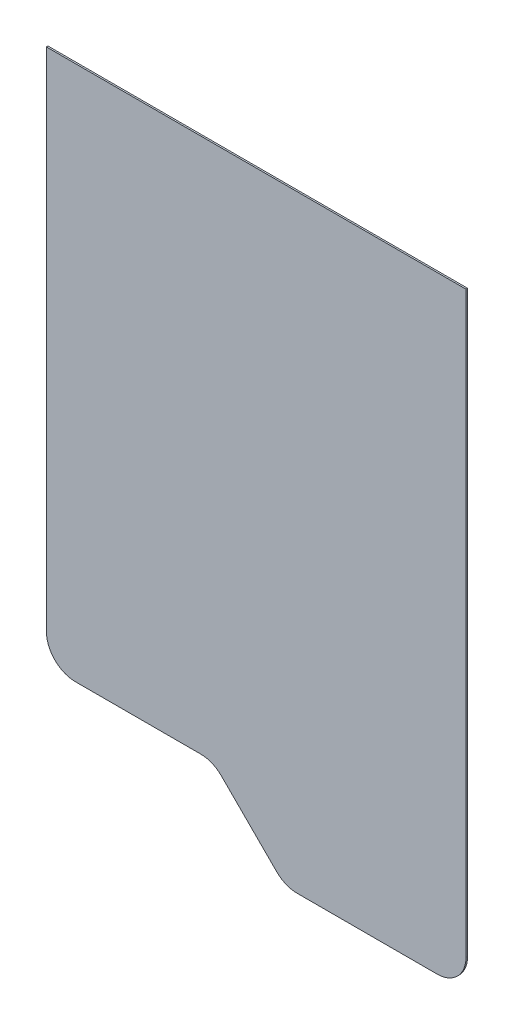
ISO-10303-21;
HEADER;
FILE_DESCRIPTION(('STEP AP214'),'2;1');
FILE_NAME('part.step','',(''),(''),'','','');
FILE_SCHEMA(('AUTOMOTIVE_DESIGN { 1 0 10303 214 1 1 1 1 }'));
ENDSEC;
DATA;
#1=APPLICATION_CONTEXT('core data for automotive mechanical design processes');
#2=APPLICATION_PROTOCOL_DEFINITION('international standard','automotive_design',2000,#1);
#3=PRODUCT_CONTEXT('',#1,'mechanical');
#4=PRODUCT('Part','Part','',(#3));
#5=PRODUCT_RELATED_PRODUCT_CATEGORY('part','',(#4));
#6=PRODUCT_DEFINITION_FORMATION('','',#4);
#7=PRODUCT_DEFINITION_CONTEXT('part definition',#1,'design');
#8=PRODUCT_DEFINITION('design','',#6,#7);
#9=PRODUCT_DEFINITION_SHAPE('','',#8);
#10=(LENGTH_UNIT() NAMED_UNIT(*) SI_UNIT(.MILLI.,.METRE.));
#11=(NAMED_UNIT(*) PLANE_ANGLE_UNIT() SI_UNIT($,.RADIAN.));
#12=(NAMED_UNIT(*) SI_UNIT($,.STERADIAN.) SOLID_ANGLE_UNIT());
#13=UNCERTAINTY_MEASURE_WITH_UNIT(LENGTH_MEASURE(1.E-05),#10,'distance_accuracy_value','');
#14=(GEOMETRIC_REPRESENTATION_CONTEXT(3) GLOBAL_UNCERTAINTY_ASSIGNED_CONTEXT((#13)) GLOBAL_UNIT_ASSIGNED_CONTEXT((#10,
#11,#12)) REPRESENTATION_CONTEXT('',''));
#15=CARTESIAN_POINT('',(0.,0.,0.));
#16=DIRECTION('',(0.,0.,1.));
#17=DIRECTION('',(1.,0.,0.));
#18=AXIS2_PLACEMENT_3D('',#15,#16,#17);
#19=CARTESIAN_POINT('',(-12.5,-60.,0.11));
#20=DIRECTION('',(0.,1.,0.));
#21=DIRECTION('',(-1.,0.,0.));
#22=AXIS2_PLACEMENT_3D('',#19,#20,#21);
#23=PLANE('',#22);
#24=DIRECTION('',(0.,0.,1.));
#25=VECTOR('',#24,1.);
#26=CARTESIAN_POINT('',(-3.8284271247462,-60.,-51.0392006206995));
#27=LINE('',#26,#25);
#28=CARTESIAN_POINT('',(-3.8284271247462,-60.,0.));
#29=VERTEX_POINT('',#28);
#30=CARTESIAN_POINT('',(-3.8284271247462,-60.,0.11));
#31=VERTEX_POINT('',#30);
#32=EDGE_CURVE('E54',#29,#31,#27,.T.);
#33=ORIENTED_EDGE('',*,*,#32,.T.);
#34=DIRECTION('',(1.,0.,0.));
#35=VECTOR('',#34,1.);
#36=CARTESIAN_POINT('',(-12.5,-60.,0.11));
#37=LINE('',#36,#35);
#38=CARTESIAN_POINT('',(-12.5,-60.,0.11));
#39=VERTEX_POINT('',#38);
#40=EDGE_CURVE('E139',#39,#31,#37,.T.);
#41=ORIENTED_EDGE('',*,*,#40,.F.);
#42=DIRECTION('',(0.,0.,-1.));
#43=VECTOR('',#42,1.);
#44=CARTESIAN_POINT('',(-12.5,-60.,0.11));
#45=LINE('',#44,#43);
#46=CARTESIAN_POINT('',(-12.5,-60.,0.));
#47=VERTEX_POINT('',#46);
#48=EDGE_CURVE('E47',#39,#47,#45,.T.);
#49=ORIENTED_EDGE('',*,*,#48,.T.);
#50=DIRECTION('',(1.,0.,0.));
#51=VECTOR('',#50,1.);
#52=CARTESIAN_POINT('',(-12.5,-60.,0.));
#53=LINE('',#52,#51);
#54=EDGE_CURVE('E59',#47,#29,#53,.T.);
#55=ORIENTED_EDGE('',*,*,#54,.T.);
#56=EDGE_LOOP('',(#33,#41,#49,#55));
#57=FACE_BOUND('',#56,.T.);
#58=ADVANCED_FACE('F39',(#57),#23,.F.);
#59=CARTESIAN_POINT('',(14.5,50.,0.11));
#60=DIRECTION('',(-1.,0.,0.));
#61=DIRECTION('',(0.,-1.,0.));
#62=AXIS2_PLACEMENT_3D('',#59,#60,#61);
#63=PLANE('',#62);
#64=DIRECTION('',(0.,1.,0.));
#65=VECTOR('',#64,1.);
#66=CARTESIAN_POINT('',(14.5,50.,0.));
#67=LINE('',#66,#65);
#68=CARTESIAN_POINT('',(14.5,-63.0000000000001,0.));
#69=VERTEX_POINT('',#68);
#70=CARTESIAN_POINT('',(14.5,-23.,0.));
#71=VERTEX_POINT('',#70);
#72=EDGE_CURVE('E169',#69,#71,#67,.T.);
#73=ORIENTED_EDGE('',*,*,#72,.T.);
#74=DIRECTION('',(0.,0.,1.));
#75=VECTOR('',#74,1.);
#76=CARTESIAN_POINT('',(14.5,-23.,0.));
#77=LINE('',#76,#75);
#78=CARTESIAN_POINT('',(14.5,-23.,0.11));
#79=VERTEX_POINT('',#78);
#80=EDGE_CURVE('E166',#71,#79,#77,.T.);
#81=ORIENTED_EDGE('',*,*,#80,.T.);
#82=DIRECTION('',(0.,1.,0.));
#83=VECTOR('',#82,1.);
#84=CARTESIAN_POINT('',(14.5,50.,0.11));
#85=LINE('',#84,#83);
#86=CARTESIAN_POINT('',(14.5,-63.0000000000001,0.11));
#87=VERTEX_POINT('',#86);
#88=EDGE_CURVE('E171',#87,#79,#85,.T.);
#89=ORIENTED_EDGE('',*,*,#88,.F.);
#90=DIRECTION('',(0.,0.,1.));
#91=VECTOR('',#90,1.);
#92=CARTESIAN_POINT('',(14.5,-63.0000000000001,-51.0392006206995));
#93=LINE('',#92,#91);
#94=EDGE_CURVE('E151',#69,#87,#93,.T.);
#95=ORIENTED_EDGE('',*,*,#94,.F.);
#96=EDGE_LOOP('',(#73,#81,#89,#95));
#97=FACE_BOUND('',#96,.T.);
#98=ADVANCED_FACE('F41',(#97),#63,.F.);
#99=CARTESIAN_POINT('',(-14.5,58.,0.11));
#100=DIRECTION('',(1.,0.,0.));
#101=DIRECTION('',(0.,1.,0.));
#102=AXIS2_PLACEMENT_3D('',#99,#100,#101);
#103=PLANE('',#102);
#104=DIRECTION('',(0.,-1.,0.));
#105=VECTOR('',#104,1.);
#106=CARTESIAN_POINT('',(-14.5,58.,0.11));
#107=LINE('',#106,#105);
#108=CARTESIAN_POINT('',(-14.5,-23.,0.11));
#109=VERTEX_POINT('',#108);
#110=CARTESIAN_POINT('',(-14.5,-58.,0.11));
#111=VERTEX_POINT('',#110);
#112=EDGE_CURVE('E174',#109,#111,#107,.T.);
#113=ORIENTED_EDGE('',*,*,#112,.F.);
#114=DIRECTION('',(0.,0.,1.));
#115=VECTOR('',#114,1.);
#116=CARTESIAN_POINT('',(-14.5,-23.,0.));
#117=LINE('',#116,#115);
#118=CARTESIAN_POINT('',(-14.5,-23.,0.));
#119=VERTEX_POINT('',#118);
#120=EDGE_CURVE('E163',#119,#109,#117,.T.);
#121=ORIENTED_EDGE('',*,*,#120,.F.);
#122=DIRECTION('',(0.,-1.,0.));
#123=VECTOR('',#122,1.);
#124=CARTESIAN_POINT('',(-14.5,58.,0.));
#125=LINE('',#124,#123);
#126=CARTESIAN_POINT('',(-14.5,-58.,0.));
#127=VERTEX_POINT('',#126);
#128=EDGE_CURVE('E181',#119,#127,#125,.T.);
#129=ORIENTED_EDGE('',*,*,#128,.T.);
#130=DIRECTION('',(0.,0.,-1.));
#131=VECTOR('',#130,1.);
#132=CARTESIAN_POINT('',(-14.5,-58.,0.11));
#133=LINE('',#132,#131);
#134=EDGE_CURVE('E11',#111,#127,#133,.T.);
#135=ORIENTED_EDGE('',*,*,#134,.F.);
#136=EDGE_LOOP('',(#113,#121,#129,#135));
#137=FACE_BOUND('',#136,.T.);
#138=ADVANCED_FACE('F226',(#137),#103,.F.);
#139=CARTESIAN_POINT('',(-12.5,-58.,0.11));
#140=DIRECTION('',(0.,0.,-1.));
#141=DIRECTION('',(-1.,0.,0.));
#142=AXIS2_PLACEMENT_3D('',#139,#140,#141);
#143=CYLINDRICAL_SURFACE('',#142,2.);
#144=CARTESIAN_POINT('',(-12.5,-58.,0.));
#145=DIRECTION('',(0.,0.,1.));
#146=DIRECTION('',(1.,0.,0.));
#147=AXIS2_PLACEMENT_3D('',#144,#145,#146);
#148=CIRCLE('',#147,2.);
#149=EDGE_CURVE('E183',#127,#47,#148,.T.);
#150=ORIENTED_EDGE('',*,*,#149,.T.);
#151=ORIENTED_EDGE('',*,*,#48,.F.);
#152=CARTESIAN_POINT('',(-12.5,-58.,0.11));
#153=DIRECTION('',(0.,0.,1.));
#154=DIRECTION('',(1.,0.,0.));
#155=AXIS2_PLACEMENT_3D('',#152,#153,#154);
#156=CIRCLE('',#155,2.);
#157=EDGE_CURVE('E176',#111,#39,#156,.T.);
#158=ORIENTED_EDGE('',*,*,#157,.F.);
#159=ORIENTED_EDGE('',*,*,#134,.T.);
#160=EDGE_LOOP('',(#150,#151,#158,#159));
#161=FACE_BOUND('',#160,.T.);
#162=ADVANCED_FACE('F231',(#161),#143,.T.);
#163=CARTESIAN_POINT('',(12.5,-58.,0.11));
#164=DIRECTION('',(0.,0.,1.));
#165=DIRECTION('',(1.,0.,0.));
#166=AXIS2_PLACEMENT_3D('',#163,#164,#165);
#167=PLANE('',#166);
#168=CARTESIAN_POINT('',(12.5,-63.0000000000001,0.11));
#169=DIRECTION('',(0.,0.,1.));
#170=DIRECTION('',(1.,0.,0.));
#171=AXIS2_PLACEMENT_3D('',#168,#169,#170);
#172=CIRCLE('',#171,1.99999999999999);
#173=CARTESIAN_POINT('',(12.5,-65.0000000000001,0.11));
#174=VERTEX_POINT('',#173);
#175=EDGE_CURVE('E149',#174,#87,#172,.T.);
#176=ORIENTED_EDGE('',*,*,#175,.T.);
#177=ORIENTED_EDGE('',*,*,#88,.T.);
#178=DIRECTION('',(1.,0.,0.));
#179=VECTOR('',#178,1.);
#180=CARTESIAN_POINT('',(-14.5,-23.,0.11));
#181=LINE('',#180,#179);
#182=EDGE_CURVE('E164',#109,#79,#181,.T.);
#183=ORIENTED_EDGE('',*,*,#182,.F.);
#184=ORIENTED_EDGE('',*,*,#112,.T.);
#185=ORIENTED_EDGE('',*,*,#157,.T.);
#186=ORIENTED_EDGE('',*,*,#40,.T.);
#187=CARTESIAN_POINT('',(-3.8284271247462,-62.,0.11));
#188=DIRECTION('',(0.,0.,-1.));
#189=DIRECTION('',(1.,0.,0.));
#190=AXIS2_PLACEMENT_3D('',#187,#188,#189);
#191=CIRCLE('',#190,2.);
#192=CARTESIAN_POINT('',(-2.41421356237311,-60.5857864376269,0.11));
#193=VERTEX_POINT('',#192);
#194=EDGE_CURVE('E122',#31,#193,#191,.T.);
#195=ORIENTED_EDGE('',*,*,#194,.T.);
#196=DIRECTION('',(0.707106781186548,-0.707106781186547,0.));
#197=VECTOR('',#196,1.);
#198=CARTESIAN_POINT('',(-2.41421356237311,-60.5857864376269,0.11));
#199=LINE('',#198,#197);
#200=CARTESIAN_POINT('',(1.41421356237316,-64.4142135623732,0.11));
#201=VERTEX_POINT('',#200);
#202=EDGE_CURVE('E129',#193,#201,#199,.T.);
#203=ORIENTED_EDGE('',*,*,#202,.T.);
#204=CARTESIAN_POINT('',(2.82842712474625,-63.0000000000001,0.11));
#205=DIRECTION('',(0.,0.,1.));
#206=DIRECTION('',(1.,0.,0.));
#207=AXIS2_PLACEMENT_3D('',#204,#205,#206);
#208=CIRCLE('',#207,2.);
#209=CARTESIAN_POINT('',(2.82842712474625,-65.0000000000001,0.11));
#210=VERTEX_POINT('',#209);
#211=EDGE_CURVE('E135',#201,#210,#208,.T.);
#212=ORIENTED_EDGE('',*,*,#211,.T.);
#213=DIRECTION('',(1.,0.,0.));
#214=VECTOR('',#213,1.);
#215=CARTESIAN_POINT('',(2.82842712474625,-65.0000000000001,0.11));
#216=LINE('',#215,#214);
#217=EDGE_CURVE('E146',#210,#174,#216,.T.);
#218=ORIENTED_EDGE('',*,*,#217,.T.);
#219=EDGE_LOOP('',(#176,#177,#183,#184,#185,#186,#195,#203,#212,#218));
#220=FACE_BOUND('',#219,.T.);
#221=ADVANCED_FACE('F138',(#220),#167,.T.);
#222=CARTESIAN_POINT('',(12.5,-58.,0.));
#223=DIRECTION('',(0.,0.,1.));
#224=DIRECTION('',(1.,0.,0.));
#225=AXIS2_PLACEMENT_3D('',#222,#223,#224);
#226=PLANE('',#225);
#227=ORIENTED_EDGE('',*,*,#72,.F.);
#228=CARTESIAN_POINT('',(12.5,-63.0000000000001,0.));
#229=DIRECTION('',(0.,0.,1.));
#230=DIRECTION('',(1.,0.,0.));
#231=AXIS2_PLACEMENT_3D('',#228,#229,#230);
#232=CIRCLE('',#231,1.99999999999999);
#233=CARTESIAN_POINT('',(12.5,-65.0000000000001,0.));
#234=VERTEX_POINT('',#233);
#235=EDGE_CURVE('E142',#69,#234,#232,.F.);
#236=ORIENTED_EDGE('',*,*,#235,.T.);
#237=DIRECTION('',(-1.,0.,0.));
#238=VECTOR('',#237,1.);
#239=CARTESIAN_POINT('',(2.82842712474625,-65.0000000000001,0.));
#240=LINE('',#239,#238);
#241=CARTESIAN_POINT('',(2.82842712474625,-65.0000000000001,0.));
#242=VERTEX_POINT('',#241);
#243=EDGE_CURVE('E197',#234,#242,#240,.T.);
#244=ORIENTED_EDGE('',*,*,#243,.T.);
#245=CARTESIAN_POINT('',(2.82842712474625,-63.0000000000001,0.));
#246=DIRECTION('',(0.,0.,1.));
#247=DIRECTION('',(1.,0.,0.));
#248=AXIS2_PLACEMENT_3D('',#245,#246,#247);
#249=CIRCLE('',#248,2.);
#250=CARTESIAN_POINT('',(1.41421356237316,-64.4142135623732,0.));
#251=VERTEX_POINT('',#250);
#252=EDGE_CURVE('E194',#242,#251,#249,.F.);
#253=ORIENTED_EDGE('',*,*,#252,.T.);
#254=DIRECTION('',(-0.707106781186548,0.707106781186547,0.));
#255=VECTOR('',#254,1.);
#256=CARTESIAN_POINT('',(-2.41421356237311,-60.5857864376269,0.));
#257=LINE('',#256,#255);
#258=CARTESIAN_POINT('',(-2.4142135623731,-60.5857864376269,0.));
#259=VERTEX_POINT('',#258);
#260=EDGE_CURVE('E192',#251,#259,#257,.T.);
#261=ORIENTED_EDGE('',*,*,#260,.T.);
#262=CARTESIAN_POINT('',(-3.8284271247462,-62.,0.));
#263=DIRECTION('',(0.,0.,1.));
#264=DIRECTION('',(1.,0.,0.));
#265=AXIS2_PLACEMENT_3D('',#262,#263,#264);
#266=CIRCLE('',#265,2.);
#267=EDGE_CURVE('E123',#259,#29,#266,.T.);
#268=ORIENTED_EDGE('',*,*,#267,.T.);
#269=ORIENTED_EDGE('',*,*,#54,.F.);
#270=ORIENTED_EDGE('',*,*,#149,.F.);
#271=ORIENTED_EDGE('',*,*,#128,.F.);
#272=DIRECTION('',(1.,0.,0.));
#273=VECTOR('',#272,1.);
#274=CARTESIAN_POINT('',(-14.5,-23.,0.));
#275=LINE('',#274,#273);
#276=EDGE_CURVE('E160',#119,#71,#275,.T.);
#277=ORIENTED_EDGE('',*,*,#276,.T.);
#278=EDGE_LOOP('',(#227,#236,#244,#253,#261,#268,#269,#270,#271,#277));
#279=FACE_BOUND('',#278,.T.);
#280=ADVANCED_FACE('F190',(#279),#226,.F.);
#281=CARTESIAN_POINT('',(-14.5,-23.,0.));
#282=DIRECTION('',(0.,-1.,0.));
#283=DIRECTION('',(0.,0.,-1.));
#284=AXIS2_PLACEMENT_3D('',#281,#282,#283);
#285=PLANE('',#284);
#286=ORIENTED_EDGE('',*,*,#182,.T.);
#287=ORIENTED_EDGE('',*,*,#80,.F.);
#288=ORIENTED_EDGE('',*,*,#276,.F.);
#289=ORIENTED_EDGE('',*,*,#120,.T.);
#290=EDGE_LOOP('',(#286,#287,#288,#289));
#291=FACE_BOUND('',#290,.T.);
#292=ADVANCED_FACE('F242',(#291),#285,.F.);
#293=CARTESIAN_POINT('',(12.5,-63.0000000000001,-51.0392006206995));
#294=DIRECTION('',(0.,0.,1.));
#295=DIRECTION('',(1.,0.,0.));
#296=AXIS2_PLACEMENT_3D('',#293,#294,#295);
#297=CYLINDRICAL_SURFACE('',#296,1.99999999999999);
#298=ORIENTED_EDGE('',*,*,#235,.F.);
#299=ORIENTED_EDGE('',*,*,#94,.T.);
#300=ORIENTED_EDGE('',*,*,#175,.F.);
#301=DIRECTION('',(0.,0.,1.));
#302=VECTOR('',#301,1.);
#303=CARTESIAN_POINT('',(12.5,-65.0000000000001,-51.0392006206995));
#304=LINE('',#303,#302);
#305=EDGE_CURVE('E154',#234,#174,#304,.T.);
#306=ORIENTED_EDGE('',*,*,#305,.F.);
#307=EDGE_LOOP('',(#298,#299,#300,#306));
#308=FACE_BOUND('',#307,.T.);
#309=ADVANCED_FACE('F209',(#308),#297,.T.);
#310=CARTESIAN_POINT('',(2.82842712474625,-65.0000000000001,-51.0392006206995));
#311=DIRECTION('',(0.,-1.,0.));
#312=DIRECTION('',(1.,0.,0.));
#313=AXIS2_PLACEMENT_3D('',#310,#311,#312);
#314=PLANE('',#313);
#315=ORIENTED_EDGE('',*,*,#243,.F.);
#316=ORIENTED_EDGE('',*,*,#305,.T.);
#317=ORIENTED_EDGE('',*,*,#217,.F.);
#318=DIRECTION('',(0.,0.,1.));
#319=VECTOR('',#318,1.);
#320=CARTESIAN_POINT('',(2.82842712474625,-65.0000000000001,-51.0392006206995));
#321=LINE('',#320,#319);
#322=EDGE_CURVE('E156',#242,#210,#321,.T.);
#323=ORIENTED_EDGE('',*,*,#322,.F.);
#324=EDGE_LOOP('',(#315,#316,#317,#323));
#325=FACE_BOUND('',#324,.T.);
#326=ADVANCED_FACE('F206',(#325),#314,.T.);
#327=CARTESIAN_POINT('',(2.82842712474625,-63.0000000000001,-51.0392006206995));
#328=DIRECTION('',(0.,0.,1.));
#329=DIRECTION('',(1.,0.,0.));
#330=AXIS2_PLACEMENT_3D('',#327,#328,#329);
#331=CYLINDRICAL_SURFACE('',#330,2.);
#332=ORIENTED_EDGE('',*,*,#252,.F.);
#333=ORIENTED_EDGE('',*,*,#322,.T.);
#334=ORIENTED_EDGE('',*,*,#211,.F.);
#335=DIRECTION('',(0.,0.,1.));
#336=VECTOR('',#335,1.);
#337=CARTESIAN_POINT('',(1.41421356237316,-64.4142135623732,-51.0392006206995));
#338=LINE('',#337,#336);
#339=EDGE_CURVE('E126',#251,#201,#338,.T.);
#340=ORIENTED_EDGE('',*,*,#339,.F.);
#341=EDGE_LOOP('',(#332,#333,#334,#340));
#342=FACE_BOUND('',#341,.T.);
#343=ADVANCED_FACE('F211',(#342),#331,.T.);
#344=CARTESIAN_POINT('',(-2.41421356237311,-60.5857864376269,-51.0392006206995));
#345=DIRECTION('',(-0.707106781186547,-0.707106781186548,0.));
#346=DIRECTION('',(0.707106781186548,-0.707106781186547,0.));
#347=AXIS2_PLACEMENT_3D('',#344,#345,#346);
#348=PLANE('',#347);
#349=ORIENTED_EDGE('',*,*,#260,.F.);
#350=ORIENTED_EDGE('',*,*,#339,.T.);
#351=ORIENTED_EDGE('',*,*,#202,.F.);
#352=DIRECTION('',(0.,0.,1.));
#353=VECTOR('',#352,1.);
#354=CARTESIAN_POINT('',(-2.41421356237311,-60.5857864376269,-51.0392006206995));
#355=LINE('',#354,#353);
#356=EDGE_CURVE('E118',#259,#193,#355,.T.);
#357=ORIENTED_EDGE('',*,*,#356,.F.);
#358=EDGE_LOOP('',(#349,#350,#351,#357));
#359=FACE_BOUND('',#358,.T.);
#360=ADVANCED_FACE('F130',(#359),#348,.T.);
#361=CARTESIAN_POINT('',(-3.8284271247462,-62.,-51.0392006206995));
#362=DIRECTION('',(0.,0.,1.));
#363=DIRECTION('',(1.,0.,0.));
#364=AXIS2_PLACEMENT_3D('',#361,#362,#363);
#365=CYLINDRICAL_SURFACE('',#364,2.);
#366=ORIENTED_EDGE('',*,*,#267,.F.);
#367=ORIENTED_EDGE('',*,*,#356,.T.);
#368=ORIENTED_EDGE('',*,*,#194,.F.);
#369=ORIENTED_EDGE('',*,*,#32,.F.);
#370=EDGE_LOOP('',(#366,#367,#368,#369));
#371=FACE_BOUND('',#370,.T.);
#372=ADVANCED_FACE('F120',(#371),#365,.F.);
#373=CLOSED_SHELL('',(#58,#98,#138,#162,#221,#280,#292,#309,#326,#343,#360,#372));
#374=MANIFOLD_SOLID_BREP('B2',#373);
#375=ADVANCED_BREP_SHAPE_REPRESENTATION('',(#18,#374),#14);
#376=SHAPE_DEFINITION_REPRESENTATION(#9,#375);
ENDSEC;
END-ISO-10303-21;
